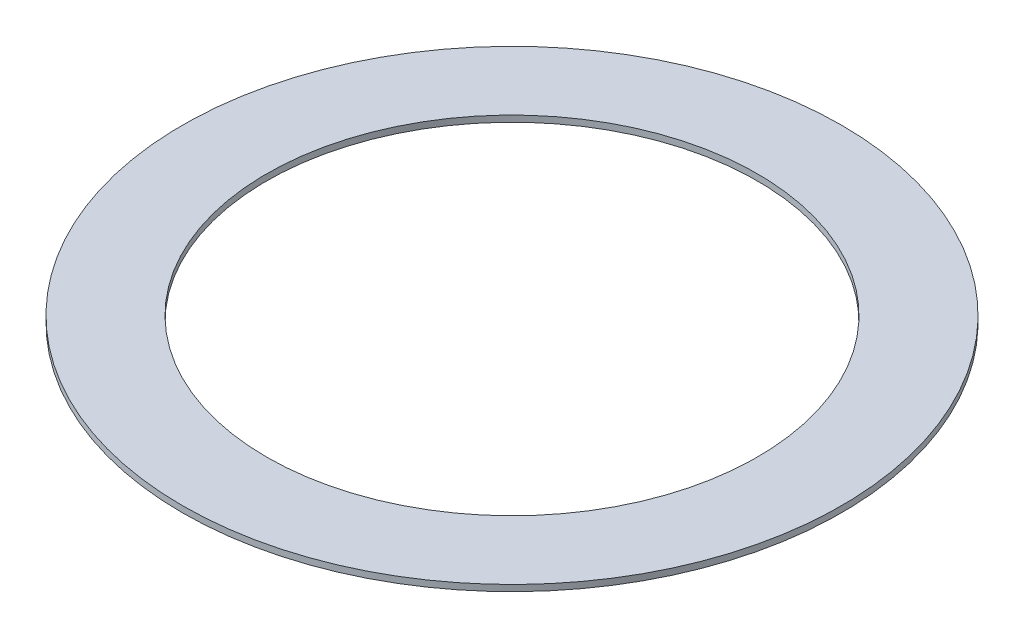
ISO-10303-21;
HEADER;
FILE_DESCRIPTION(('STEP AP214'),'2;1');
FILE_NAME('part.step','',(''),(''),'','','');
FILE_SCHEMA(('AUTOMOTIVE_DESIGN { 1 0 10303 214 1 1 1 1 }'));
ENDSEC;
DATA;
#1=APPLICATION_CONTEXT('core data for automotive mechanical design processes');
#2=APPLICATION_PROTOCOL_DEFINITION('international standard','automotive_design',2000,#1);
#3=PRODUCT_CONTEXT('',#1,'mechanical');
#4=PRODUCT('Part','Part','',(#3));
#5=PRODUCT_RELATED_PRODUCT_CATEGORY('part','',(#4));
#6=PRODUCT_DEFINITION_FORMATION('','',#4);
#7=PRODUCT_DEFINITION_CONTEXT('part definition',#1,'design');
#8=PRODUCT_DEFINITION('design','',#6,#7);
#9=PRODUCT_DEFINITION_SHAPE('','',#8);
#10=(LENGTH_UNIT() NAMED_UNIT(*) SI_UNIT(.MILLI.,.METRE.));
#11=(NAMED_UNIT(*) PLANE_ANGLE_UNIT() SI_UNIT($,.RADIAN.));
#12=(NAMED_UNIT(*) SI_UNIT($,.STERADIAN.) SOLID_ANGLE_UNIT());
#13=UNCERTAINTY_MEASURE_WITH_UNIT(LENGTH_MEASURE(1.E-05),#10,'distance_accuracy_value','');
#14=(GEOMETRIC_REPRESENTATION_CONTEXT(3) GLOBAL_UNCERTAINTY_ASSIGNED_CONTEXT((#13)) GLOBAL_UNIT_ASSIGNED_CONTEXT((#10,
#11,#12)) REPRESENTATION_CONTEXT('',''));
#15=CARTESIAN_POINT('',(0.,0.,0.));
#16=DIRECTION('',(0.,0.,1.));
#17=DIRECTION('',(1.,0.,0.));
#18=AXIS2_PLACEMENT_3D('',#15,#16,#17);
#19=CARTESIAN_POINT('',(0.,3.,0.));
#20=DIRECTION('',(0.,1.,0.));
#21=DIRECTION('',(0.,0.,1.));
#22=AXIS2_PLACEMENT_3D('',#19,#20,#21);
#23=PLANE('',#22);
#24=CARTESIAN_POINT('',(0.,3.,0.));
#25=DIRECTION('',(0.,1.,0.));
#26=DIRECTION('',(0.,0.,1.));
#27=AXIS2_PLACEMENT_3D('',#24,#25,#26);
#28=CIRCLE('',#27,158.636590549029);
#29=CARTESIAN_POINT('',(0.,3.,158.636590549029));
#30=VERTEX_POINT('',#29);
#31=EDGE_CURVE('E10',#30,#30,#28,.T.);
#32=ORIENTED_EDGE('',*,*,#31,.T.);
#33=EDGE_LOOP('',(#32));
#34=FACE_BOUND('',#33,.T.);
#35=CARTESIAN_POINT('',(0.,3.,0.));
#36=DIRECTION('',(0.,1.,0.));
#37=DIRECTION('',(0.,0.,1.));
#38=AXIS2_PLACEMENT_3D('',#35,#36,#37);
#39=CIRCLE('',#38,118.120967126399);
#40=CARTESIAN_POINT('',(0.,3.,118.120967126399));
#41=VERTEX_POINT('',#40);
#42=EDGE_CURVE('E42',#41,#41,#39,.T.);
#43=ORIENTED_EDGE('',*,*,#42,.F.);
#44=EDGE_LOOP('',(#43));
#45=FACE_BOUND('',#44,.T.);
#46=ADVANCED_FACE('F31',(#34,#45),#23,.T.);
#47=CARTESIAN_POINT('',(0.,0.,0.));
#48=DIRECTION('',(0.,1.,0.));
#49=DIRECTION('',(0.,0.,1.));
#50=AXIS2_PLACEMENT_3D('',#47,#48,#49);
#51=PLANE('',#50);
#52=CARTESIAN_POINT('',(0.,0.,0.));
#53=DIRECTION('',(0.,1.,0.));
#54=DIRECTION('',(0.,0.,1.));
#55=AXIS2_PLACEMENT_3D('',#52,#53,#54);
#56=CIRCLE('',#55,158.636590549029);
#57=CARTESIAN_POINT('',(0.,0.,158.636590549029));
#58=VERTEX_POINT('',#57);
#59=EDGE_CURVE('E35',#58,#58,#56,.T.);
#60=ORIENTED_EDGE('',*,*,#59,.F.);
#61=EDGE_LOOP('',(#60));
#62=FACE_BOUND('',#61,.T.);
#63=CARTESIAN_POINT('',(0.,0.,0.));
#64=DIRECTION('',(0.,1.,0.));
#65=DIRECTION('',(0.,0.,1.));
#66=AXIS2_PLACEMENT_3D('',#63,#64,#65);
#67=CIRCLE('',#66,118.120967126399);
#68=CARTESIAN_POINT('',(0.,0.,118.120967126399));
#69=VERTEX_POINT('',#68);
#70=EDGE_CURVE('E44',#69,#69,#67,.T.);
#71=ORIENTED_EDGE('',*,*,#70,.T.);
#72=EDGE_LOOP('',(#71));
#73=FACE_BOUND('',#72,.T.);
#74=ADVANCED_FACE('F54',(#62,#73),#51,.F.);
#75=CARTESIAN_POINT('',(0.,3.,0.));
#76=DIRECTION('',(0.,-1.,0.));
#77=DIRECTION('',(0.,0.,-1.));
#78=AXIS2_PLACEMENT_3D('',#75,#76,#77);
#79=CYLINDRICAL_SURFACE('',#78,158.636590549029);
#80=ORIENTED_EDGE('',*,*,#31,.F.);
#81=EDGE_LOOP('',(#80));
#82=FACE_BOUND('',#81,.T.);
#83=ORIENTED_EDGE('',*,*,#59,.T.);
#84=EDGE_LOOP('',(#83));
#85=FACE_BOUND('',#84,.T.);
#86=ADVANCED_FACE('F33',(#82,#85),#79,.T.);
#87=CARTESIAN_POINT('',(0.,3.,0.));
#88=DIRECTION('',(0.,-1.,0.));
#89=DIRECTION('',(0.,0.,-1.));
#90=AXIS2_PLACEMENT_3D('',#87,#88,#89);
#91=CYLINDRICAL_SURFACE('',#90,118.120967126399);
#92=ORIENTED_EDGE('',*,*,#42,.T.);
#93=EDGE_LOOP('',(#92));
#94=FACE_BOUND('',#93,.T.);
#95=ORIENTED_EDGE('',*,*,#70,.F.);
#96=EDGE_LOOP('',(#95));
#97=FACE_BOUND('',#96,.T.);
#98=ADVANCED_FACE('F50',(#94,#97),#91,.F.);
#99=CLOSED_SHELL('',(#46,#74,#86,#98));
#100=MANIFOLD_SOLID_BREP('B2',#99);
#101=ADVANCED_BREP_SHAPE_REPRESENTATION('',(#18,#100),#14);
#102=SHAPE_DEFINITION_REPRESENTATION(#9,#101);
ENDSEC;
END-ISO-10303-21;
